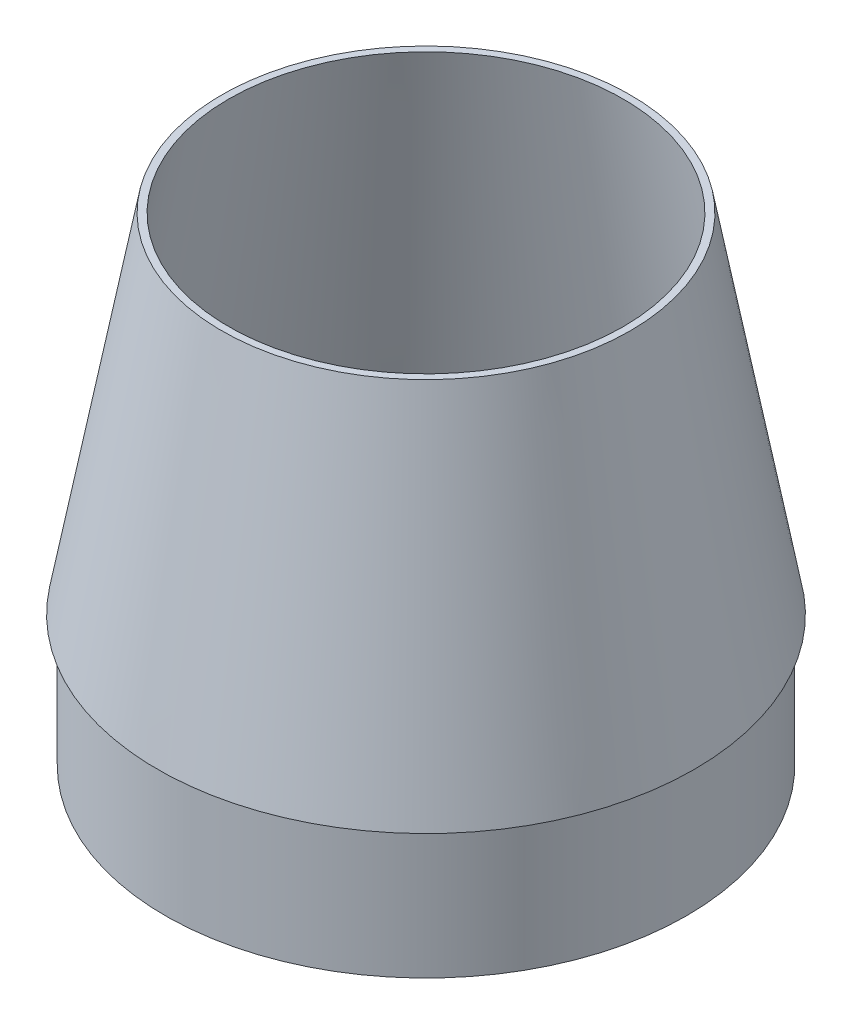
ISO-10303-21;
HEADER;
FILE_DESCRIPTION(('STEP AP214'),'2;1');
FILE_NAME('part.step','',(''),(''),'','','');
FILE_SCHEMA(('AUTOMOTIVE_DESIGN { 1 0 10303 214 1 1 1 1 }'));
ENDSEC;
DATA;
#1=APPLICATION_CONTEXT('core data for automotive mechanical design processes');
#2=APPLICATION_PROTOCOL_DEFINITION('international standard','automotive_design',2000,#1);
#3=PRODUCT_CONTEXT('',#1,'mechanical');
#4=PRODUCT('Part','Part','',(#3));
#5=PRODUCT_RELATED_PRODUCT_CATEGORY('part','',(#4));
#6=PRODUCT_DEFINITION_FORMATION('','',#4);
#7=PRODUCT_DEFINITION_CONTEXT('part definition',#1,'design');
#8=PRODUCT_DEFINITION('design','',#6,#7);
#9=PRODUCT_DEFINITION_SHAPE('','',#8);
#10=(LENGTH_UNIT() NAMED_UNIT(*) SI_UNIT(.MILLI.,.METRE.));
#11=(NAMED_UNIT(*) PLANE_ANGLE_UNIT() SI_UNIT($,.RADIAN.));
#12=(NAMED_UNIT(*) SI_UNIT($,.STERADIAN.) SOLID_ANGLE_UNIT());
#13=UNCERTAINTY_MEASURE_WITH_UNIT(LENGTH_MEASURE(1.E-05),#10,'distance_accuracy_value','');
#14=(GEOMETRIC_REPRESENTATION_CONTEXT(3) GLOBAL_UNCERTAINTY_ASSIGNED_CONTEXT((#13)) GLOBAL_UNIT_ASSIGNED_CONTEXT((#10,
#11,#12)) REPRESENTATION_CONTEXT('',''));
#15=CARTESIAN_POINT('',(0.,0.,0.));
#16=DIRECTION('',(0.,0.,1.));
#17=DIRECTION('',(1.,0.,0.));
#18=AXIS2_PLACEMENT_3D('',#15,#16,#17);
#19=CARTESIAN_POINT('',(0.,139.7,0.));
#20=DIRECTION('',(0.,1.,0.));
#21=DIRECTION('',(-1.,0.,0.));
#22=AXIS2_PLACEMENT_3D('',#19,#20,#21);
#23=PLANE('',#22);
#24=CARTESIAN_POINT('',(0.,139.7,0.));
#25=DIRECTION('',(0.,1.,0.));
#26=DIRECTION('',(-1.,0.,0.));
#27=AXIS2_PLACEMENT_3D('',#24,#25,#26);
#28=CIRCLE('',#27,57.6112345688106);
#29=CARTESIAN_POINT('',(-57.6112345688106,139.7,0.));
#30=VERTEX_POINT('',#29);
#31=EDGE_CURVE('E56',#30,#30,#28,.F.);
#32=ORIENTED_EDGE('',*,*,#31,.T.);
#33=EDGE_LOOP('',(#32));
#34=FACE_BOUND('',#33,.T.);
#35=CARTESIAN_POINT('',(0.,139.7,0.));
#36=DIRECTION('',(0.,-1.,0.));
#37=DIRECTION('',(1.,0.,0.));
#38=AXIS2_PLACEMENT_3D('',#35,#36,#37);
#39=CIRCLE('',#38,59.6773);
#40=CARTESIAN_POINT('',(59.6773,139.7,0.));
#41=VERTEX_POINT('',#40);
#42=EDGE_CURVE('E10',#41,#41,#39,.T.);
#43=ORIENTED_EDGE('',*,*,#42,.F.);
#44=EDGE_LOOP('',(#43));
#45=FACE_BOUND('',#44,.T.);
#46=ADVANCED_FACE('F37',(#34,#45),#23,.T.);
#47=CARTESIAN_POINT('',(0.,38.1,0.));
#48=DIRECTION('',(0.,-1.,0.));
#49=DIRECTION('',(1.,0.,0.));
#50=AXIS2_PLACEMENT_3D('',#47,#48,#49);
#51=CONICAL_SURFACE('',#50,78.359,0.181843776683325);
#52=ORIENTED_EDGE('',*,*,#42,.T.);
#53=EDGE_LOOP('',(#52));
#54=FACE_BOUND('',#53,.T.);
#55=CARTESIAN_POINT('',(0.,38.1,0.));
#56=DIRECTION('',(0.,-1.,0.));
#57=DIRECTION('',(1.,0.,0.));
#58=AXIS2_PLACEMENT_3D('',#55,#56,#57);
#59=CIRCLE('',#58,78.359);
#60=CARTESIAN_POINT('',(78.359,38.1,0.));
#61=VERTEX_POINT('',#60);
#62=EDGE_CURVE('E43',#61,#61,#59,.T.);
#63=ORIENTED_EDGE('',*,*,#62,.F.);
#64=EDGE_LOOP('',(#63));
#65=FACE_BOUND('',#64,.T.);
#66=ADVANCED_FACE('F98',(#54,#65),#51,.T.);
#67=CARTESIAN_POINT('',(78.359,38.1,0.));
#68=DIRECTION('',(0.,-1.,0.));
#69=DIRECTION('',(1.,0.,0.));
#70=AXIS2_PLACEMENT_3D('',#67,#68,#69);
#71=PLANE('',#70);
#72=ORIENTED_EDGE('',*,*,#62,.T.);
#73=EDGE_LOOP('',(#72));
#74=FACE_BOUND('',#73,.T.);
#75=CARTESIAN_POINT('',(0.,38.1,0.));
#76=DIRECTION('',(0.,-1.,0.));
#77=DIRECTION('',(1.,0.,0.));
#78=AXIS2_PLACEMENT_3D('',#75,#76,#77);
#79=CIRCLE('',#78,76.1619);
#80=CARTESIAN_POINT('',(76.1619,38.1,0.));
#81=VERTEX_POINT('',#80);
#82=EDGE_CURVE('E47',#81,#81,#79,.T.);
#83=ORIENTED_EDGE('',*,*,#82,.F.);
#84=EDGE_LOOP('',(#83));
#85=FACE_BOUND('',#84,.T.);
#86=ADVANCED_FACE('F91',(#74,#85),#71,.T.);
#87=CARTESIAN_POINT('',(0.,0.,0.));
#88=DIRECTION('',(0.,-1.,0.));
#89=DIRECTION('',(1.,0.,0.));
#90=AXIS2_PLACEMENT_3D('',#87,#88,#89);
#91=CYLINDRICAL_SURFACE('',#90,76.1619);
#92=ORIENTED_EDGE('',*,*,#82,.T.);
#93=EDGE_LOOP('',(#92));
#94=FACE_BOUND('',#93,.T.);
#95=CARTESIAN_POINT('',(0.,0.,0.));
#96=DIRECTION('',(0.,-1.,0.));
#97=DIRECTION('',(1.,0.,0.));
#98=AXIS2_PLACEMENT_3D('',#95,#96,#97);
#99=CIRCLE('',#98,76.1619);
#100=CARTESIAN_POINT('',(76.1619,0.,0.));
#101=VERTEX_POINT('',#100);
#102=EDGE_CURVE('E51',#101,#101,#99,.T.);
#103=ORIENTED_EDGE('',*,*,#102,.F.);
#104=EDGE_LOOP('',(#103));
#105=FACE_BOUND('',#104,.T.);
#106=ADVANCED_FACE('F86',(#94,#105),#91,.T.);
#107=CARTESIAN_POINT('',(76.1619,0.,0.));
#108=DIRECTION('',(0.,-1.,0.));
#109=DIRECTION('',(1.,0.,0.));
#110=AXIS2_PLACEMENT_3D('',#107,#108,#109);
#111=PLANE('',#110);
#112=CARTESIAN_POINT('',(0.,0.,0.));
#113=DIRECTION('',(0.,-1.,0.));
#114=DIRECTION('',(1.,0.,0.));
#115=AXIS2_PLACEMENT_3D('',#112,#113,#114);
#116=CIRCLE('',#115,74.1299);
#117=CARTESIAN_POINT('',(74.1299,0.,0.));
#118=VERTEX_POINT('',#117);
#119=EDGE_CURVE('E57',#118,#118,#116,.T.);
#120=ORIENTED_EDGE('',*,*,#119,.F.);
#121=EDGE_LOOP('',(#120));
#122=FACE_BOUND('',#121,.T.);
#123=ORIENTED_EDGE('',*,*,#102,.T.);
#124=EDGE_LOOP('',(#123));
#125=FACE_BOUND('',#124,.T.);
#126=ADVANCED_FACE('F83',(#122,#125),#111,.T.);
#127=CARTESIAN_POINT('',(0.,37.7325265034985,0.));
#128=DIRECTION('',(0.,-1.,0.));
#129=DIRECTION('',(1.,0.,0.));
#130=AXIS2_PLACEMENT_3D('',#127,#128,#129);
#131=CONICAL_SURFACE('',#130,76.3605037579798,0.181843776683325);
#132=ORIENTED_EDGE('',*,*,#31,.F.);
#133=EDGE_LOOP('',(#132));
#134=FACE_BOUND('',#133,.T.);
#135=CARTESIAN_POINT('',(0.,40.132,0.));
#136=DIRECTION('',(0.,-1.,0.));
#137=DIRECTION('',(1.,0.,0.));
#138=AXIS2_PLACEMENT_3D('',#135,#136,#137);
#139=CIRCLE('',#138,75.9193005688106);
#140=CARTESIAN_POINT('',(75.9193005688106,40.132,0.));
#141=VERTEX_POINT('',#140);
#142=EDGE_CURVE('E63',#141,#141,#139,.T.);
#143=ORIENTED_EDGE('',*,*,#142,.T.);
#144=EDGE_LOOP('',(#143));
#145=FACE_BOUND('',#144,.T.);
#146=ADVANCED_FACE('F69',(#134,#145),#131,.F.);
#147=CARTESIAN_POINT('',(78.359,40.132,0.));
#148=DIRECTION('',(0.,-1.,0.));
#149=DIRECTION('',(1.,0.,0.));
#150=AXIS2_PLACEMENT_3D('',#147,#148,#149);
#151=PLANE('',#150);
#152=ORIENTED_EDGE('',*,*,#142,.F.);
#153=EDGE_LOOP('',(#152));
#154=FACE_BOUND('',#153,.T.);
#155=CARTESIAN_POINT('',(0.,40.132,0.));
#156=DIRECTION('',(0.,-1.,0.));
#157=DIRECTION('',(1.,0.,0.));
#158=AXIS2_PLACEMENT_3D('',#155,#156,#157);
#159=CIRCLE('',#158,74.1299);
#160=CARTESIAN_POINT('',(74.1299,40.132,0.));
#161=VERTEX_POINT('',#160);
#162=EDGE_CURVE('E60',#161,#161,#159,.T.);
#163=ORIENTED_EDGE('',*,*,#162,.T.);
#164=EDGE_LOOP('',(#163));
#165=FACE_BOUND('',#164,.T.);
#166=ADVANCED_FACE('F71',(#154,#165),#151,.F.);
#167=CARTESIAN_POINT('',(0.,0.,0.));
#168=DIRECTION('',(0.,-1.,0.));
#169=DIRECTION('',(1.,0.,0.));
#170=AXIS2_PLACEMENT_3D('',#167,#168,#169);
#171=CYLINDRICAL_SURFACE('',#170,74.1299);
#172=ORIENTED_EDGE('',*,*,#162,.F.);
#173=EDGE_LOOP('',(#172));
#174=FACE_BOUND('',#173,.T.);
#175=ORIENTED_EDGE('',*,*,#119,.T.);
#176=EDGE_LOOP('',(#175));
#177=FACE_BOUND('',#176,.T.);
#178=ADVANCED_FACE('F74',(#174,#177),#171,.F.);
#179=CLOSED_SHELL('',(#46,#66,#86,#106,#126,#146,#166,#178));
#180=MANIFOLD_SOLID_BREP('B2',#179);
#181=ADVANCED_BREP_SHAPE_REPRESENTATION('',(#18,#180),#14);
#182=SHAPE_DEFINITION_REPRESENTATION(#9,#181);
ENDSEC;
END-ISO-10303-21;
